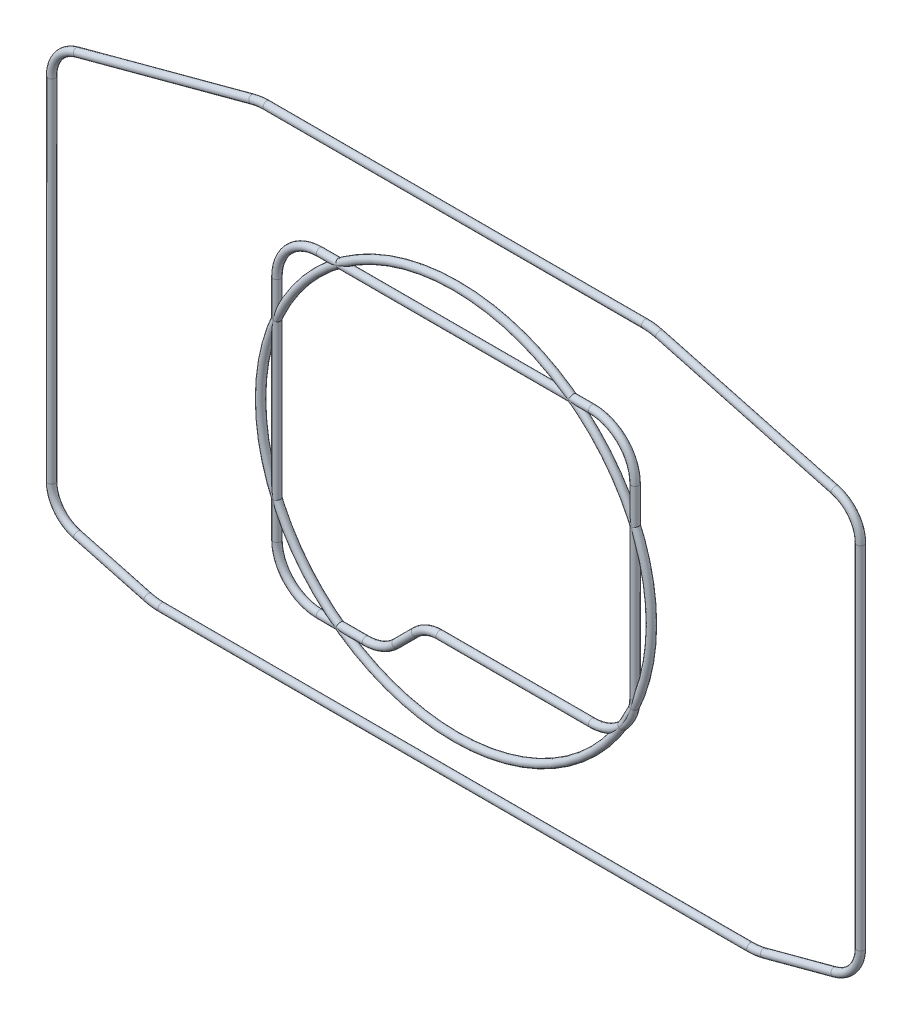
ISO-10303-21;
HEADER;
FILE_DESCRIPTION(('STEP AP214'),'2;1');
FILE_NAME('part.step','',(''),(''),'','','');
FILE_SCHEMA(('AUTOMOTIVE_DESIGN { 1 0 10303 214 1 1 1 1 }'));
ENDSEC;
DATA;
#1=APPLICATION_CONTEXT('core data for automotive mechanical design processes');
#2=APPLICATION_PROTOCOL_DEFINITION('international standard','automotive_design',2000,#1);
#3=PRODUCT_CONTEXT('',#1,'mechanical');
#4=PRODUCT('Part','Part','',(#3));
#5=PRODUCT_RELATED_PRODUCT_CATEGORY('part','',(#4));
#6=PRODUCT_DEFINITION_FORMATION('','',#4);
#7=PRODUCT_DEFINITION_CONTEXT('part definition',#1,'design');
#8=PRODUCT_DEFINITION('design','',#6,#7);
#9=PRODUCT_DEFINITION_SHAPE('','',#8);
#10=(LENGTH_UNIT() NAMED_UNIT(*) SI_UNIT(.MILLI.,.METRE.));
#11=(NAMED_UNIT(*) PLANE_ANGLE_UNIT() SI_UNIT($,.RADIAN.));
#12=(NAMED_UNIT(*) SI_UNIT($,.STERADIAN.) SOLID_ANGLE_UNIT());
#13=UNCERTAINTY_MEASURE_WITH_UNIT(LENGTH_MEASURE(1.E-05),#10,'distance_accuracy_value','');
#14=(GEOMETRIC_REPRESENTATION_CONTEXT(3) GLOBAL_UNCERTAINTY_ASSIGNED_CONTEXT((#13)) GLOBAL_UNIT_ASSIGNED_CONTEXT((#10,
#11,#12)) REPRESENTATION_CONTEXT('',''));
#15=CARTESIAN_POINT('',(0.,0.,0.));
#16=DIRECTION('',(0.,0.,1.));
#17=DIRECTION('',(1.,0.,0.));
#18=AXIS2_PLACEMENT_3D('',#15,#16,#17);
#19=CARTESIAN_POINT('',(0.,0.,0.));
#20=DIRECTION('',(0.,0.,1.));
#21=DIRECTION('',(1.,0.,0.));
#22=AXIS2_PLACEMENT_3D('',#19,#20,#21);
#23=TOROIDAL_SURFACE('',#22,79.,1.5);
#24=CARTESIAN_POINT('',(80.5,0.,0.));
#25=VERTEX_POINT('',#24);
#26=VERTEX_LOOP('',#25);
#27=FACE_BOUND('',#26,.T.);
#28=ADVANCED_FACE('F51',(#27),#23,.T.);
#29=CLOSED_SHELL('',(#28));
#30=MANIFOLD_SOLID_BREP('B2',#29);
#31=CARTESIAN_POINT('',(149.5,70.7219180182316,0.));
#32=DIRECTION('',(0.,0.,-1.));
#33=DIRECTION('',(-1.,0.,0.));
#34=AXIS2_PLACEMENT_3D('',#31,#32,#33);
#35=TOROIDAL_SURFACE('',#34,13.9999999999999,1.5);
#36=CARTESIAN_POINT('',(153.123466631435,84.2448795862784,0.));
#37=DIRECTION('',(-0.965925826289073,0.258819045102503,0.));
#38=DIRECTION('',(0.,0.,1.));
#39=AXIS2_PLACEMENT_3D('',#36,#37,#38);
#40=CIRCLE('',#39,1.5);
#41=CARTESIAN_POINT('',(153.511695199089,85.693768325712,0.));
#42=VERTEX_POINT('',#41);
#43=EDGE_CURVE('E80',#42,#42,#40,.T.);
#44=CARTESIAN_POINT('',(163.5,70.7219180182315,0.));
#45=DIRECTION('',(0.,1.,0.));
#46=DIRECTION('',(0.,0.,1.));
#47=AXIS2_PLACEMENT_3D('',#44,#45,#46);
#48=CIRCLE('',#47,1.5);
#49=CARTESIAN_POINT('',(165.,70.7219180182315,0.));
#50=VERTEX_POINT('',#49);
#51=EDGE_CURVE('E50',#50,#50,#48,.T.);
#52=CARTESIAN_POINT('',(149.5,70.7219180182316,0.));
#53=DIRECTION('',(0.,0.,-1.));
#54=DIRECTION('',(-1.,0.,0.));
#55=AXIS2_PLACEMENT_3D('',#52,#53,#54);
#56=CIRCLE('',#55,15.4999999999999);
#57=EDGE_CURVE('',#42,#50,#56,.T.);
#58=ORIENTED_EDGE('',*,*,#43,.F.);
#59=ORIENTED_EDGE('',*,*,#51,.T.);
#60=ORIENTED_EDGE('',*,*,#57,.T.);
#61=ORIENTED_EDGE('',*,*,#57,.F.);
#62=EDGE_LOOP('',(#58,#60,#59,#61));
#63=FACE_BOUND('',#62,.T.);
#64=ADVANCED_FACE('F74',(#63),#35,.T.);
#65=CARTESIAN_POINT('',(82.1940175831183,103.250368178359,0.));
#66=DIRECTION('',(0.965925826289068,-0.258819045102521,0.));
#67=DIRECTION('',(0.258819045102521,0.965925826289068,0.));
#68=AXIS2_PLACEMENT_3D('',#65,#66,#67);
#69=CYLINDRICAL_SURFACE('',#68,1.5);
#70=CARTESIAN_POINT('',(82.1940175831183,103.250368178359,0.));
#71=DIRECTION('',(-0.965925826289073,0.258819045102503,0.));
#72=DIRECTION('',(0.,0.,1.));
#73=AXIS2_PLACEMENT_3D('',#70,#71,#72);
#74=CIRCLE('',#73,1.5);
#75=CARTESIAN_POINT('',(82.5822461507721,104.699256917793,0.));
#76=VERTEX_POINT('',#75);
#77=EDGE_CURVE('E84',#76,#76,#74,.T.);
#78=ORIENTED_EDGE('',*,*,#77,.F.);
#79=EDGE_LOOP('',(#78));
#80=FACE_BOUND('',#79,.T.);
#81=ORIENTED_EDGE('',*,*,#43,.T.);
#82=EDGE_LOOP('',(#81));
#83=FACE_BOUND('',#82,.T.);
#84=ADVANCED_FACE('F208',(#80,#83),#69,.T.);
#85=CARTESIAN_POINT('',(76.499998590863,82.,0.));
#86=DIRECTION('',(0.,0.,-1.));
#87=DIRECTION('',(-1.,0.,0.));
#88=AXIS2_PLACEMENT_3D('',#85,#86,#87);
#89=TOROIDAL_SURFACE('',#88,21.9999999999999,1.5);
#90=CARTESIAN_POINT('',(76.4999985908631,104.,0.));
#91=DIRECTION('',(-1.,0.,0.));
#92=DIRECTION('',(0.,0.,1.));
#93=AXIS2_PLACEMENT_3D('',#90,#91,#92);
#94=CIRCLE('',#93,1.5);
#95=CARTESIAN_POINT('',(76.4999985908631,105.5,0.));
#96=VERTEX_POINT('',#95);
#97=EDGE_CURVE('E88',#96,#96,#94,.T.);
#98=CARTESIAN_POINT('',(76.499998590863,82.,0.));
#99=DIRECTION('',(0.,0.,-1.));
#100=DIRECTION('',(-1.,0.,0.));
#101=AXIS2_PLACEMENT_3D('',#98,#99,#100);
#102=CIRCLE('',#101,23.4999999999999);
#103=EDGE_CURVE('',#96,#76,#102,.T.);
#104=ORIENTED_EDGE('',*,*,#97,.F.);
#105=ORIENTED_EDGE('',*,*,#77,.T.);
#106=ORIENTED_EDGE('',*,*,#103,.T.);
#107=ORIENTED_EDGE('',*,*,#103,.F.);
#108=EDGE_LOOP('',(#104,#106,#105,#107));
#109=FACE_BOUND('',#108,.T.);
#110=ADVANCED_FACE('F202',(#109),#89,.T.);
#111=CARTESIAN_POINT('',(-76.499998590863,104.,0.));
#112=DIRECTION('',(1.,0.,0.));
#113=DIRECTION('',(0.,1.,0.));
#114=AXIS2_PLACEMENT_3D('',#111,#112,#113);
#115=CYLINDRICAL_SURFACE('',#114,1.5);
#116=CARTESIAN_POINT('',(-76.499998590863,104.,0.));
#117=DIRECTION('',(-1.,0.,0.));
#118=DIRECTION('',(0.,0.,1.));
#119=AXIS2_PLACEMENT_3D('',#116,#117,#118);
#120=CIRCLE('',#119,1.5);
#121=CARTESIAN_POINT('',(-76.499998590863,105.5,0.));
#122=VERTEX_POINT('',#121);
#123=EDGE_CURVE('E93',#122,#122,#120,.T.);
#124=ORIENTED_EDGE('',*,*,#123,.F.);
#125=EDGE_LOOP('',(#124));
#126=FACE_BOUND('',#125,.T.);
#127=ORIENTED_EDGE('',*,*,#97,.T.);
#128=EDGE_LOOP('',(#127));
#129=FACE_BOUND('',#128,.T.);
#130=ADVANCED_FACE('F196',(#126,#129),#115,.T.);
#131=CARTESIAN_POINT('',(-76.499998590863,82.,0.));
#132=DIRECTION('',(0.,0.,-1.));
#133=DIRECTION('',(-1.,0.,0.));
#134=AXIS2_PLACEMENT_3D('',#131,#132,#133);
#135=TOROIDAL_SURFACE('',#134,21.9999999999999,1.5);
#136=CARTESIAN_POINT('',(-82.1940175831184,103.250368178359,0.));
#137=DIRECTION('',(-0.965925826289066,-0.258819045102529,0.));
#138=DIRECTION('',(0.,0.,1.));
#139=AXIS2_PLACEMENT_3D('',#136,#137,#138);
#140=CIRCLE('',#139,1.5);
#141=CARTESIAN_POINT('',(-82.5822461507722,104.699256917793,0.));
#142=VERTEX_POINT('',#141);
#143=EDGE_CURVE('E96',#142,#142,#140,.T.);
#144=CARTESIAN_POINT('',(-76.499998590863,82.,0.));
#145=DIRECTION('',(0.,0.,-1.));
#146=DIRECTION('',(-1.,0.,0.));
#147=AXIS2_PLACEMENT_3D('',#144,#145,#146);
#148=CIRCLE('',#147,23.4999999999999);
#149=EDGE_CURVE('',#142,#122,#148,.T.);
#150=ORIENTED_EDGE('',*,*,#143,.F.);
#151=ORIENTED_EDGE('',*,*,#123,.T.);
#152=ORIENTED_EDGE('',*,*,#149,.T.);
#153=ORIENTED_EDGE('',*,*,#149,.F.);
#154=EDGE_LOOP('',(#150,#152,#151,#153));
#155=FACE_BOUND('',#154,.T.);
#156=ADVANCED_FACE('F190',(#155),#135,.T.);
#157=CARTESIAN_POINT('',(-153.123466631435,84.2448795862785,0.));
#158=DIRECTION('',(0.965925826289068,0.258819045102521,0.));
#159=DIRECTION('',(-0.258819045102521,0.965925826289068,0.));
#160=AXIS2_PLACEMENT_3D('',#157,#158,#159);
#161=CYLINDRICAL_SURFACE('',#160,1.5);
#162=CARTESIAN_POINT('',(-153.123466631435,84.2448795862785,0.));
#163=DIRECTION('',(-0.965925826289066,-0.258819045102529,0.));
#164=DIRECTION('',(0.,0.,1.));
#165=AXIS2_PLACEMENT_3D('',#162,#163,#164);
#166=CIRCLE('',#165,1.5);
#167=CARTESIAN_POINT('',(-153.511695199089,85.6937683257121,0.));
#168=VERTEX_POINT('',#167);
#169=EDGE_CURVE('E99',#168,#168,#166,.T.);
#170=ORIENTED_EDGE('',*,*,#169,.F.);
#171=EDGE_LOOP('',(#170));
#172=FACE_BOUND('',#171,.T.);
#173=ORIENTED_EDGE('',*,*,#143,.T.);
#174=EDGE_LOOP('',(#173));
#175=FACE_BOUND('',#174,.T.);
#176=ADVANCED_FACE('F184',(#172,#175),#161,.T.);
#177=CARTESIAN_POINT('',(-149.5,70.7219180182316,0.));
#178=DIRECTION('',(0.,0.,-1.));
#179=DIRECTION('',(-1.,0.,0.));
#180=AXIS2_PLACEMENT_3D('',#177,#178,#179);
#181=TOROIDAL_SURFACE('',#180,14.,1.5);
#182=CARTESIAN_POINT('',(-163.5,70.7219180182316,0.));
#183=DIRECTION('',(0.,-1.,0.));
#184=DIRECTION('',(0.,0.,1.));
#185=AXIS2_PLACEMENT_3D('',#182,#183,#184);
#186=CIRCLE('',#185,1.5);
#187=CARTESIAN_POINT('',(-165.,70.7219180182316,0.));
#188=VERTEX_POINT('',#187);
#189=EDGE_CURVE('E102',#188,#188,#186,.T.);
#190=CARTESIAN_POINT('',(-149.5,70.7219180182316,0.));
#191=DIRECTION('',(0.,0.,-1.));
#192=DIRECTION('',(-1.,0.,0.));
#193=AXIS2_PLACEMENT_3D('',#190,#191,#192);
#194=CIRCLE('',#193,15.5);
#195=EDGE_CURVE('',#188,#168,#194,.T.);
#196=ORIENTED_EDGE('',*,*,#189,.F.);
#197=ORIENTED_EDGE('',*,*,#169,.T.);
#198=ORIENTED_EDGE('',*,*,#195,.T.);
#199=ORIENTED_EDGE('',*,*,#195,.F.);
#200=EDGE_LOOP('',(#196,#198,#197,#199));
#201=FACE_BOUND('',#200,.T.);
#202=ADVANCED_FACE('F178',(#201),#181,.T.);
#203=CARTESIAN_POINT('',(-163.5,-71.1097590741314,0.));
#204=DIRECTION('',(0.,1.,0.));
#205=DIRECTION('',(0.,0.,1.));
#206=AXIS2_PLACEMENT_3D('',#203,#204,#205);
#207=CYLINDRICAL_SURFACE('',#206,1.5);
#208=CARTESIAN_POINT('',(-163.5,-71.1097590741314,0.));
#209=DIRECTION('',(0.,-1.,0.));
#210=DIRECTION('',(0.,0.,1.));
#211=AXIS2_PLACEMENT_3D('',#208,#209,#210);
#212=CIRCLE('',#211,1.5);
#213=CARTESIAN_POINT('',(-165.,-71.1097590741314,0.));
#214=VERTEX_POINT('',#213);
#215=EDGE_CURVE('E105',#214,#214,#212,.T.);
#216=ORIENTED_EDGE('',*,*,#215,.F.);
#217=EDGE_LOOP('',(#216));
#218=FACE_BOUND('',#217,.T.);
#219=ORIENTED_EDGE('',*,*,#189,.T.);
#220=EDGE_LOOP('',(#219));
#221=FACE_BOUND('',#220,.T.);
#222=ADVANCED_FACE('F172',(#218,#221),#207,.T.);
#223=CARTESIAN_POINT('',(-149.5,-71.1097590741314,0.));
#224=DIRECTION('',(0.,0.,-1.));
#225=DIRECTION('',(-1.,0.,0.));
#226=AXIS2_PLACEMENT_3D('',#223,#224,#225);
#227=TOROIDAL_SURFACE('',#226,14.,1.5);
#228=CARTESIAN_POINT('',(-153.123466631435,-84.6327206421783,0.));
#229=DIRECTION('',(0.96592582628907,-0.258819045102515,0.));
#230=DIRECTION('',(0.,0.,1.));
#231=AXIS2_PLACEMENT_3D('',#228,#229,#230);
#232=CIRCLE('',#231,1.5);
#233=CARTESIAN_POINT('',(-153.511695199089,-86.0816093816119,0.));
#234=VERTEX_POINT('',#233);
#235=EDGE_CURVE('E108',#234,#234,#232,.T.);
#236=CARTESIAN_POINT('',(-149.5,-71.1097590741314,0.));
#237=DIRECTION('',(0.,0.,-1.));
#238=DIRECTION('',(-1.,0.,0.));
#239=AXIS2_PLACEMENT_3D('',#236,#237,#238);
#240=CIRCLE('',#239,15.5);
#241=EDGE_CURVE('',#234,#214,#240,.T.);
#242=ORIENTED_EDGE('',*,*,#235,.F.);
#243=ORIENTED_EDGE('',*,*,#215,.T.);
#244=ORIENTED_EDGE('',*,*,#241,.T.);
#245=ORIENTED_EDGE('',*,*,#241,.F.);
#246=EDGE_LOOP('',(#242,#244,#243,#245));
#247=FACE_BOUND('',#246,.T.);
#248=ADVANCED_FACE('F166',(#247),#227,.T.);
#249=CARTESIAN_POINT('',(-124.694018992255,-92.2503681783594,0.));
#250=DIRECTION('',(-0.965925826289068,0.258819045102521,0.));
#251=DIRECTION('',(-0.258819045102521,-0.965925826289068,0.));
#252=AXIS2_PLACEMENT_3D('',#249,#250,#251);
#253=CYLINDRICAL_SURFACE('',#252,1.5);
#254=CARTESIAN_POINT('',(-124.694018992255,-92.2503681783594,0.));
#255=DIRECTION('',(0.96592582628907,-0.258819045102515,0.));
#256=DIRECTION('',(0.,0.,1.));
#257=AXIS2_PLACEMENT_3D('',#254,#255,#256);
#258=CIRCLE('',#257,1.5);
#259=CARTESIAN_POINT('',(-125.082247559909,-93.6992569177931,0.));
#260=VERTEX_POINT('',#259);
#261=EDGE_CURVE('E111',#260,#260,#258,.T.);
#262=ORIENTED_EDGE('',*,*,#261,.F.);
#263=EDGE_LOOP('',(#262));
#264=FACE_BOUND('',#263,.T.);
#265=ORIENTED_EDGE('',*,*,#235,.T.);
#266=EDGE_LOOP('',(#265));
#267=FACE_BOUND('',#266,.T.);
#268=ADVANCED_FACE('F160',(#264,#267),#253,.T.);
#269=CARTESIAN_POINT('',(-119.,-71.,0.));
#270=DIRECTION('',(0.,0.,-1.));
#271=DIRECTION('',(-1.,0.,0.));
#272=AXIS2_PLACEMENT_3D('',#269,#270,#271);
#273=TOROIDAL_SURFACE('',#272,22.,1.5);
#274=CARTESIAN_POINT('',(-119.,-92.9999999999999,0.));
#275=DIRECTION('',(1.,0.,0.));
#276=DIRECTION('',(0.,0.,1.));
#277=AXIS2_PLACEMENT_3D('',#274,#275,#276);
#278=CIRCLE('',#277,1.5);
#279=CARTESIAN_POINT('',(-119.,-94.4999999999999,0.));
#280=VERTEX_POINT('',#279);
#281=EDGE_CURVE('E114',#280,#280,#278,.T.);
#282=CARTESIAN_POINT('',(-119.,-71.,0.));
#283=DIRECTION('',(0.,0.,-1.));
#284=DIRECTION('',(-1.,0.,0.));
#285=AXIS2_PLACEMENT_3D('',#282,#283,#284);
#286=CIRCLE('',#285,23.4999999999999);
#287=EDGE_CURVE('',#280,#260,#286,.T.);
#288=ORIENTED_EDGE('',*,*,#281,.F.);
#289=ORIENTED_EDGE('',*,*,#261,.T.);
#290=ORIENTED_EDGE('',*,*,#287,.T.);
#291=ORIENTED_EDGE('',*,*,#287,.F.);
#292=EDGE_LOOP('',(#288,#290,#289,#291));
#293=FACE_BOUND('',#292,.T.);
#294=ADVANCED_FACE('F154',(#293),#273,.T.);
#295=CARTESIAN_POINT('',(119.,-92.9999999999999,0.));
#296=DIRECTION('',(-1.,0.,0.));
#297=DIRECTION('',(0.,0.,1.));
#298=AXIS2_PLACEMENT_3D('',#295,#296,#297);
#299=CYLINDRICAL_SURFACE('',#298,1.5);
#300=CARTESIAN_POINT('',(119.,-92.9999999999999,0.));
#301=DIRECTION('',(1.,0.,0.));
#302=DIRECTION('',(0.,0.,1.));
#303=AXIS2_PLACEMENT_3D('',#300,#301,#302);
#304=CIRCLE('',#303,1.5);
#305=CARTESIAN_POINT('',(119.,-94.4999999999999,0.));
#306=VERTEX_POINT('',#305);
#307=EDGE_CURVE('E117',#306,#306,#304,.T.);
#308=ORIENTED_EDGE('',*,*,#307,.F.);
#309=EDGE_LOOP('',(#308));
#310=FACE_BOUND('',#309,.T.);
#311=ORIENTED_EDGE('',*,*,#281,.T.);
#312=EDGE_LOOP('',(#311));
#313=FACE_BOUND('',#312,.T.);
#314=ADVANCED_FACE('F148',(#310,#313),#299,.T.);
#315=CARTESIAN_POINT('',(119.,-71.,0.));
#316=DIRECTION('',(0.,0.,-1.));
#317=DIRECTION('',(-1.,0.,0.));
#318=AXIS2_PLACEMENT_3D('',#315,#316,#317);
#319=TOROIDAL_SURFACE('',#318,21.9999999999999,1.5);
#320=CARTESIAN_POINT('',(124.694018992255,-92.2503681783594,0.));
#321=DIRECTION('',(0.965925826289066,0.25881904510253,0.));
#322=DIRECTION('',(0.,0.,1.));
#323=AXIS2_PLACEMENT_3D('',#320,#321,#322);
#324=CIRCLE('',#323,1.5);
#325=CARTESIAN_POINT('',(125.082247559909,-93.699256917793,0.));
#326=VERTEX_POINT('',#325);
#327=EDGE_CURVE('E120',#326,#326,#324,.T.);
#328=CARTESIAN_POINT('',(119.,-71.,0.));
#329=DIRECTION('',(0.,0.,-1.));
#330=DIRECTION('',(-1.,0.,0.));
#331=AXIS2_PLACEMENT_3D('',#328,#329,#330);
#332=CIRCLE('',#331,23.4999999999999);
#333=EDGE_CURVE('',#326,#306,#332,.T.);
#334=ORIENTED_EDGE('',*,*,#327,.F.);
#335=ORIENTED_EDGE('',*,*,#307,.T.);
#336=ORIENTED_EDGE('',*,*,#333,.T.);
#337=ORIENTED_EDGE('',*,*,#333,.F.);
#338=EDGE_LOOP('',(#334,#336,#335,#337));
#339=FACE_BOUND('',#338,.T.);
#340=ADVANCED_FACE('F142',(#339),#319,.T.);
#341=CARTESIAN_POINT('',(153.123466631435,-84.6327206421782,0.));
#342=DIRECTION('',(-0.965925826289068,-0.258819045102523,0.));
#343=DIRECTION('',(0.258819045102523,-0.965925826289068,0.));
#344=AXIS2_PLACEMENT_3D('',#341,#342,#343);
#345=CYLINDRICAL_SURFACE('',#344,1.5);
#346=CARTESIAN_POINT('',(153.123466631435,-84.6327206421782,0.));
#347=DIRECTION('',(0.965925826289066,0.25881904510253,0.));
#348=DIRECTION('',(0.,0.,1.));
#349=AXIS2_PLACEMENT_3D('',#346,#347,#348);
#350=CIRCLE('',#349,1.5);
#351=CARTESIAN_POINT('',(153.511695199089,-86.0816093816118,0.));
#352=VERTEX_POINT('',#351);
#353=EDGE_CURVE('E123',#352,#352,#350,.T.);
#354=ORIENTED_EDGE('',*,*,#353,.F.);
#355=EDGE_LOOP('',(#354));
#356=FACE_BOUND('',#355,.T.);
#357=ORIENTED_EDGE('',*,*,#327,.T.);
#358=EDGE_LOOP('',(#357));
#359=FACE_BOUND('',#358,.T.);
#360=ADVANCED_FACE('F136',(#356,#359),#345,.T.);
#361=CARTESIAN_POINT('',(149.5,-71.1097590741313,0.));
#362=DIRECTION('',(0.,0.,-1.));
#363=DIRECTION('',(-1.,0.,0.));
#364=AXIS2_PLACEMENT_3D('',#361,#362,#363);
#365=TOROIDAL_SURFACE('',#364,14.,1.5);
#366=CARTESIAN_POINT('',(163.5,-71.1097590741314,0.));
#367=DIRECTION('',(0.,1.,0.));
#368=DIRECTION('',(0.,0.,1.));
#369=AXIS2_PLACEMENT_3D('',#366,#367,#368);
#370=CIRCLE('',#369,1.5);
#371=CARTESIAN_POINT('',(165.,-71.1097590741314,0.));
#372=VERTEX_POINT('',#371);
#373=EDGE_CURVE('E126',#372,#372,#370,.T.);
#374=CARTESIAN_POINT('',(149.5,-71.1097590741313,0.));
#375=DIRECTION('',(0.,0.,-1.));
#376=DIRECTION('',(-1.,0.,0.));
#377=AXIS2_PLACEMENT_3D('',#374,#375,#376);
#378=CIRCLE('',#377,15.5);
#379=EDGE_CURVE('',#372,#352,#378,.T.);
#380=ORIENTED_EDGE('',*,*,#373,.F.);
#381=ORIENTED_EDGE('',*,*,#353,.T.);
#382=ORIENTED_EDGE('',*,*,#379,.T.);
#383=ORIENTED_EDGE('',*,*,#379,.F.);
#384=EDGE_LOOP('',(#380,#382,#381,#383));
#385=FACE_BOUND('',#384,.T.);
#386=ADVANCED_FACE('F133',(#385),#365,.T.);
#387=CARTESIAN_POINT('',(163.5,-71.1097590741314,0.));
#388=DIRECTION('',(0.,1.,0.));
#389=DIRECTION('',(0.,0.,1.));
#390=AXIS2_PLACEMENT_3D('',#387,#388,#389);
#391=CYLINDRICAL_SURFACE('',#390,1.5);
#392=ORIENTED_EDGE('',*,*,#373,.T.);
#393=EDGE_LOOP('',(#392));
#394=FACE_BOUND('',#393,.T.);
#395=ORIENTED_EDGE('',*,*,#51,.F.);
#396=EDGE_LOOP('',(#395));
#397=FACE_BOUND('',#396,.T.);
#398=ADVANCED_FACE('F130',(#394,#397),#391,.T.);
#399=CLOSED_SHELL('',(#64,#84,#110,#130,#156,#176,#202,#222,#248,#268,#294,#314,#340,#360,#386,#398));
#400=MANIFOLD_SOLID_BREP('B6_NOT_SHOWN',#399);
#401=CARTESIAN_POINT('',(55.,46.,0.));
#402=DIRECTION('',(0.,0.,-1.));
#403=DIRECTION('',(-1.,0.,0.));
#404=AXIS2_PLACEMENT_3D('',#401,#402,#403);
#405=TOROIDAL_SURFACE('',#404,17.4000000000004,1.5);
#406=CARTESIAN_POINT('',(55.,63.4000000000004,0.));
#407=DIRECTION('',(-1.,0.,0.));
#408=DIRECTION('',(0.,0.,1.));
#409=AXIS2_PLACEMENT_3D('',#406,#407,#408);
#410=CIRCLE('',#409,1.5);
#411=CARTESIAN_POINT('',(55.,64.9000000000004,0.));
#412=VERTEX_POINT('',#411);
#413=EDGE_CURVE('E388',#412,#412,#410,.T.);
#414=CARTESIAN_POINT('',(72.4000000000004,46.,0.));
#415=DIRECTION('',(0.,1.,0.));
#416=DIRECTION('',(0.,0.,1.));
#417=AXIS2_PLACEMENT_3D('',#414,#415,#416);
#418=CIRCLE('',#417,1.5);
#419=CARTESIAN_POINT('',(73.9000000000004,46.,0.));
#420=VERTEX_POINT('',#419);
#421=EDGE_CURVE('E73',#420,#420,#418,.T.);
#422=CARTESIAN_POINT('',(55.,46.,0.));
#423=DIRECTION('',(0.,0.,-1.));
#424=DIRECTION('',(-1.,0.,0.));
#425=AXIS2_PLACEMENT_3D('',#422,#423,#424);
#426=CIRCLE('',#425,18.9000000000004);
#427=EDGE_CURVE('',#412,#420,#426,.T.);
#428=ORIENTED_EDGE('',*,*,#413,.F.);
#429=ORIENTED_EDGE('',*,*,#421,.T.);
#430=ORIENTED_EDGE('',*,*,#427,.T.);
#431=ORIENTED_EDGE('',*,*,#427,.F.);
#432=EDGE_LOOP('',(#428,#430,#429,#431));
#433=FACE_BOUND('',#432,.T.);
#434=ADVANCED_FACE('F382',(#433),#405,.T.);
#435=CARTESIAN_POINT('',(-55.,63.4000000000004,0.));
#436=DIRECTION('',(1.,0.,0.));
#437=DIRECTION('',(0.,1.,0.));
#438=AXIS2_PLACEMENT_3D('',#435,#436,#437);
#439=CYLINDRICAL_SURFACE('',#438,1.5);
#440=CARTESIAN_POINT('',(-55.,63.4000000000004,0.));
#441=DIRECTION('',(-1.,0.,0.));
#442=DIRECTION('',(0.,0.,1.));
#443=AXIS2_PLACEMENT_3D('',#440,#441,#442);
#444=CIRCLE('',#443,1.5);
#445=CARTESIAN_POINT('',(-55.,64.9000000000004,0.));
#446=VERTEX_POINT('',#445);
#447=EDGE_CURVE('E392',#446,#446,#444,.T.);
#448=ORIENTED_EDGE('',*,*,#447,.F.);
#449=EDGE_LOOP('',(#448));
#450=FACE_BOUND('',#449,.T.);
#451=ORIENTED_EDGE('',*,*,#413,.T.);
#452=EDGE_LOOP('',(#451));
#453=FACE_BOUND('',#452,.T.);
#454=ADVANCED_FACE('F480',(#450,#453),#439,.T.);
#455=CARTESIAN_POINT('',(-55.,46.,0.));
#456=DIRECTION('',(0.,0.,-1.));
#457=DIRECTION('',(-1.,0.,0.));
#458=AXIS2_PLACEMENT_3D('',#455,#456,#457);
#459=TOROIDAL_SURFACE('',#458,17.4000000000004,1.5);
#460=CARTESIAN_POINT('',(-72.4000000000004,46.,0.));
#461=DIRECTION('',(0.,-1.,0.));
#462=DIRECTION('',(0.,0.,1.));
#463=AXIS2_PLACEMENT_3D('',#460,#461,#462);
#464=CIRCLE('',#463,1.5);
#465=CARTESIAN_POINT('',(-73.9000000000004,46.,0.));
#466=VERTEX_POINT('',#465);
#467=EDGE_CURVE('E396',#466,#466,#464,.T.);
#468=CARTESIAN_POINT('',(-55.,46.,0.));
#469=DIRECTION('',(0.,0.,-1.));
#470=DIRECTION('',(-1.,0.,0.));
#471=AXIS2_PLACEMENT_3D('',#468,#469,#470);
#472=CIRCLE('',#471,18.9000000000004);
#473=EDGE_CURVE('',#466,#446,#472,.T.);
#474=ORIENTED_EDGE('',*,*,#467,.F.);
#475=ORIENTED_EDGE('',*,*,#447,.T.);
#476=ORIENTED_EDGE('',*,*,#473,.T.);
#477=ORIENTED_EDGE('',*,*,#473,.F.);
#478=EDGE_LOOP('',(#474,#476,#475,#477));
#479=FACE_BOUND('',#478,.T.);
#480=ADVANCED_FACE('F474',(#479),#459,.T.);
#481=CARTESIAN_POINT('',(-72.4000000000004,-46.,0.));
#482=DIRECTION('',(0.,1.,0.));
#483=DIRECTION('',(-1.,0.,0.));
#484=AXIS2_PLACEMENT_3D('',#481,#482,#483);
#485=CYLINDRICAL_SURFACE('',#484,1.5);
#486=CARTESIAN_POINT('',(-72.4000000000004,-46.,0.));
#487=DIRECTION('',(0.,-1.,0.));
#488=DIRECTION('',(0.,0.,1.));
#489=AXIS2_PLACEMENT_3D('',#486,#487,#488);
#490=CIRCLE('',#489,1.5);
#491=CARTESIAN_POINT('',(-73.9000000000004,-46.,0.));
#492=VERTEX_POINT('',#491);
#493=EDGE_CURVE('E401',#492,#492,#490,.T.);
#494=ORIENTED_EDGE('',*,*,#493,.F.);
#495=EDGE_LOOP('',(#494));
#496=FACE_BOUND('',#495,.T.);
#497=ORIENTED_EDGE('',*,*,#467,.T.);
#498=EDGE_LOOP('',(#497));
#499=FACE_BOUND('',#498,.T.);
#500=ADVANCED_FACE('F468',(#496,#499),#485,.T.);
#501=CARTESIAN_POINT('',(-55.,-46.,0.));
#502=DIRECTION('',(0.,0.,-1.));
#503=DIRECTION('',(-1.,0.,0.));
#504=AXIS2_PLACEMENT_3D('',#501,#502,#503);
#505=TOROIDAL_SURFACE('',#504,17.4000000000004,1.5);
#506=CARTESIAN_POINT('',(-55.,-63.4000000000004,0.));
#507=DIRECTION('',(1.,0.,0.));
#508=DIRECTION('',(0.,0.,1.));
#509=AXIS2_PLACEMENT_3D('',#506,#507,#508);
#510=CIRCLE('',#509,1.5);
#511=CARTESIAN_POINT('',(-55.,-64.9000000000004,0.));
#512=VERTEX_POINT('',#511);
#513=EDGE_CURVE('E404',#512,#512,#510,.T.);
#514=CARTESIAN_POINT('',(-55.,-46.,0.));
#515=DIRECTION('',(0.,0.,-1.));
#516=DIRECTION('',(-1.,0.,0.));
#517=AXIS2_PLACEMENT_3D('',#514,#515,#516);
#518=CIRCLE('',#517,18.9000000000004);
#519=EDGE_CURVE('',#512,#492,#518,.T.);
#520=ORIENTED_EDGE('',*,*,#513,.F.);
#521=ORIENTED_EDGE('',*,*,#493,.T.);
#522=ORIENTED_EDGE('',*,*,#519,.T.);
#523=ORIENTED_EDGE('',*,*,#519,.F.);
#524=EDGE_LOOP('',(#520,#522,#521,#523));
#525=FACE_BOUND('',#524,.T.);
#526=ADVANCED_FACE('F462',(#525),#505,.T.);
#527=CARTESIAN_POINT('',(-36.4203102167832,-63.4000000000004,0.));
#528=DIRECTION('',(-1.,0.,0.));
#529=DIRECTION('',(0.,-1.,0.));
#530=AXIS2_PLACEMENT_3D('',#527,#528,#529);
#531=CYLINDRICAL_SURFACE('',#530,1.5);
#532=CARTESIAN_POINT('',(-36.4203102167832,-63.4000000000004,0.));
#533=DIRECTION('',(1.,0.,0.));
#534=DIRECTION('',(0.,0.,1.));
#535=AXIS2_PLACEMENT_3D('',#532,#533,#534);
#536=CIRCLE('',#535,1.5);
#537=CARTESIAN_POINT('',(-36.4203102167832,-64.9000000000004,0.));
#538=VERTEX_POINT('',#537);
#539=EDGE_CURVE('E407',#538,#538,#536,.T.);
#540=ORIENTED_EDGE('',*,*,#539,.F.);
#541=EDGE_LOOP('',(#540));
#542=FACE_BOUND('',#541,.T.);
#543=ORIENTED_EDGE('',*,*,#513,.T.);
#544=EDGE_LOOP('',(#543));
#545=FACE_BOUND('',#544,.T.);
#546=ADVANCED_FACE('F456',(#542,#545),#531,.T.);
#547=CARTESIAN_POINT('',(-36.4203102167832,-46.,0.));
#548=DIRECTION('',(0.,0.,-1.));
#549=DIRECTION('',(-1.,0.,0.));
#550=AXIS2_PLACEMENT_3D('',#547,#548,#549);
#551=TOROIDAL_SURFACE('',#550,17.4000000000004,1.5);
#552=CARTESIAN_POINT('',(-24.1166522241369,-58.3036579926462,0.));
#553=DIRECTION('',(0.707106781186565,0.70710678118653,0.));
#554=DIRECTION('',(0.,0.,1.));
#555=AXIS2_PLACEMENT_3D('',#552,#553,#554);
#556=CIRCLE('',#555,1.5);
#557=CARTESIAN_POINT('',(-23.0559920523571,-59.364318164426,0.));
#558=VERTEX_POINT('',#557);
#559=EDGE_CURVE('E410',#558,#558,#556,.T.);
#560=CARTESIAN_POINT('',(-36.4203102167832,-46.,0.));
#561=DIRECTION('',(0.,0.,-1.));
#562=DIRECTION('',(-1.,0.,0.));
#563=AXIS2_PLACEMENT_3D('',#560,#561,#562);
#564=CIRCLE('',#563,18.9000000000004);
#565=EDGE_CURVE('',#558,#538,#564,.T.);
#566=ORIENTED_EDGE('',*,*,#559,.F.);
#567=ORIENTED_EDGE('',*,*,#539,.T.);
#568=ORIENTED_EDGE('',*,*,#565,.T.);
#569=ORIENTED_EDGE('',*,*,#565,.F.);
#570=EDGE_LOOP('',(#566,#568,#567,#569));
#571=FACE_BOUND('',#570,.T.);
#572=ADVANCED_FACE('F450',(#571),#551,.T.);
#573=CARTESIAN_POINT('',(-16.196342007353,-50.3833477758628,0.));
#574=DIRECTION('',(-0.707106781186572,-0.707106781186523,0.));
#575=DIRECTION('',(0.707106781186523,-0.707106781186572,0.));
#576=AXIS2_PLACEMENT_3D('',#573,#574,#575);
#577=CYLINDRICAL_SURFACE('',#576,1.5);
#578=CARTESIAN_POINT('',(-16.196342007353,-50.3833477758628,0.));
#579=DIRECTION('',(0.707106781186565,0.70710678118653,0.));
#580=DIRECTION('',(0.,0.,1.));
#581=AXIS2_PLACEMENT_3D('',#578,#579,#580);
#582=CIRCLE('',#581,1.5);
#583=CARTESIAN_POINT('',(-17.2570021791328,-49.3226876040829,0.));
#584=VERTEX_POINT('',#583);
#585=EDGE_CURVE('E413',#584,#584,#582,.T.);
#586=ORIENTED_EDGE('',*,*,#585,.F.);
#587=EDGE_LOOP('',(#586));
#588=FACE_BOUND('',#587,.T.);
#589=ORIENTED_EDGE('',*,*,#559,.T.);
#590=EDGE_LOOP('',(#589));
#591=FACE_BOUND('',#590,.T.);
#592=ADVANCED_FACE('F444',(#588,#591),#577,.T.);
#593=CARTESIAN_POINT('',(-6.57968978321644,-59.9999999999992,0.));
#594=DIRECTION('',(0.,0.,1.));
#595=DIRECTION('',(1.,0.,0.));
#596=AXIS2_PLACEMENT_3D('',#593,#594,#595);
#597=TOROIDAL_SURFACE('',#596,13.5999999999992,1.5);
#598=CARTESIAN_POINT('',(-6.57968978321682,-46.4,0.));
#599=DIRECTION('',(1.,0.,0.));
#600=DIRECTION('',(0.,0.,1.));
#601=AXIS2_PLACEMENT_3D('',#598,#599,#600);
#602=CIRCLE('',#601,1.5);
#603=CARTESIAN_POINT('',(-6.57968978321686,-44.9,0.));
#604=VERTEX_POINT('',#603);
#605=EDGE_CURVE('E416',#604,#604,#602,.T.);
#606=CARTESIAN_POINT('',(-6.57968978321644,-59.9999999999992,0.));
#607=DIRECTION('',(0.,0.,1.));
#608=DIRECTION('',(1.,0.,0.));
#609=AXIS2_PLACEMENT_3D('',#606,#607,#608);
#610=CIRCLE('',#609,15.0999999999992);
#611=EDGE_CURVE('',#604,#584,#610,.T.);
#612=ORIENTED_EDGE('',*,*,#605,.F.);
#613=ORIENTED_EDGE('',*,*,#585,.T.);
#614=ORIENTED_EDGE('',*,*,#611,.T.);
#615=ORIENTED_EDGE('',*,*,#611,.F.);
#616=EDGE_LOOP('',(#612,#614,#613,#615));
#617=FACE_BOUND('',#616,.T.);
#618=ADVANCED_FACE('F438',(#617),#597,.T.);
#619=CARTESIAN_POINT('',(55.,-46.4,0.));
#620=DIRECTION('',(-1.,0.,0.));
#621=DIRECTION('',(0.,0.,1.));
#622=AXIS2_PLACEMENT_3D('',#619,#620,#621);
#623=CYLINDRICAL_SURFACE('',#622,1.5);
#624=CARTESIAN_POINT('',(55.,-46.4,0.));
#625=DIRECTION('',(1.,0.,0.));
#626=DIRECTION('',(0.,0.,1.));
#627=AXIS2_PLACEMENT_3D('',#624,#625,#626);
#628=CIRCLE('',#627,1.5);
#629=CARTESIAN_POINT('',(55.,-47.9,0.));
#630=VERTEX_POINT('',#629);
#631=EDGE_CURVE('E419',#630,#630,#628,.T.);
#632=ORIENTED_EDGE('',*,*,#631,.F.);
#633=EDGE_LOOP('',(#632));
#634=FACE_BOUND('',#633,.T.);
#635=ORIENTED_EDGE('',*,*,#605,.T.);
#636=EDGE_LOOP('',(#635));
#637=FACE_BOUND('',#636,.T.);
#638=ADVANCED_FACE('F432',(#634,#637),#623,.T.);
#639=CARTESIAN_POINT('',(55.,-29.,0.));
#640=DIRECTION('',(0.,0.,-1.));
#641=DIRECTION('',(-1.,0.,0.));
#642=AXIS2_PLACEMENT_3D('',#639,#640,#641);
#643=TOROIDAL_SURFACE('',#642,17.4,1.5);
#644=CARTESIAN_POINT('',(72.4,-29.,0.));
#645=DIRECTION('',(0.,1.,0.));
#646=DIRECTION('',(0.,0.,1.));
#647=AXIS2_PLACEMENT_3D('',#644,#645,#646);
#648=CIRCLE('',#647,1.5);
#649=CARTESIAN_POINT('',(73.9,-29.,0.));
#650=VERTEX_POINT('',#649);
#651=EDGE_CURVE('E422',#650,#650,#648,.T.);
#652=CARTESIAN_POINT('',(55.,-29.,0.));
#653=DIRECTION('',(0.,0.,-1.));
#654=DIRECTION('',(-1.,0.,0.));
#655=AXIS2_PLACEMENT_3D('',#652,#653,#654);
#656=CIRCLE('',#655,18.9);
#657=EDGE_CURVE('',#650,#630,#656,.T.);
#658=ORIENTED_EDGE('',*,*,#651,.F.);
#659=ORIENTED_EDGE('',*,*,#631,.T.);
#660=ORIENTED_EDGE('',*,*,#657,.T.);
#661=ORIENTED_EDGE('',*,*,#657,.F.);
#662=EDGE_LOOP('',(#658,#660,#659,#661));
#663=FACE_BOUND('',#662,.T.);
#664=ADVANCED_FACE('F429',(#663),#643,.T.);
#665=CARTESIAN_POINT('',(72.4,-29.,0.));
#666=DIRECTION('',(0.,1.,0.));
#667=DIRECTION('',(0.,0.,1.));
#668=AXIS2_PLACEMENT_3D('',#665,#666,#667);
#669=CYLINDRICAL_SURFACE('',#668,1.5);
#670=ORIENTED_EDGE('',*,*,#651,.T.);
#671=EDGE_LOOP('',(#670));
#672=FACE_BOUND('',#671,.T.);
#673=ORIENTED_EDGE('',*,*,#421,.F.);
#674=EDGE_LOOP('',(#673));
#675=FACE_BOUND('',#674,.T.);
#676=ADVANCED_FACE('F426',(#672,#675),#669,.T.);
#677=CLOSED_SHELL('',(#434,#454,#480,#500,#526,#546,#572,#592,#618,#638,#664,#676));
#678=MANIFOLD_SOLID_BREP('B45_NOT_SHOWN',#677);
#679=ADVANCED_BREP_SHAPE_REPRESENTATION('',(#18,#30,#400,#678),#14);
#680=SHAPE_DEFINITION_REPRESENTATION(#9,#679);
ENDSEC;
END-ISO-10303-21;
